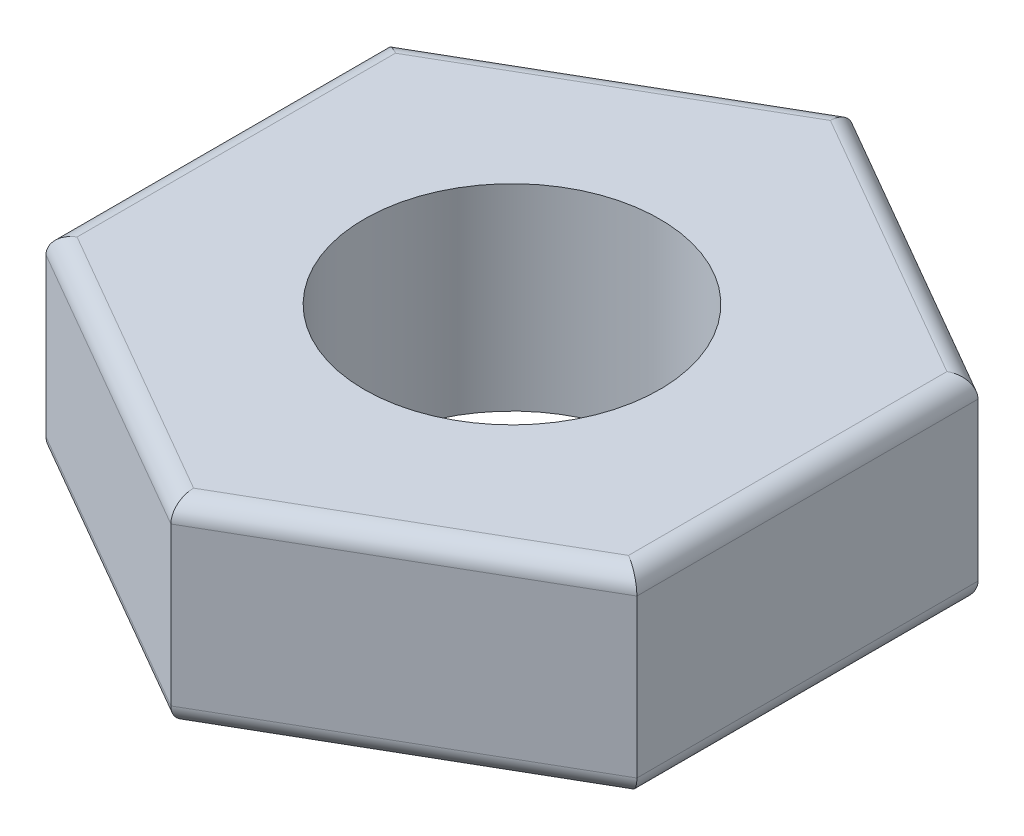
ISO-10303-21;
HEADER;
FILE_DESCRIPTION(('STEP AP214'),'2;1');
FILE_NAME('part.step','',(''),(''),'','','');
FILE_SCHEMA(('AUTOMOTIVE_DESIGN { 1 0 10303 214 1 1 1 1 }'));
ENDSEC;
DATA;
#1=APPLICATION_CONTEXT('core data for automotive mechanical design processes');
#2=APPLICATION_PROTOCOL_DEFINITION('international standard','automotive_design',2000,#1);
#3=PRODUCT_CONTEXT('',#1,'mechanical');
#4=PRODUCT('Part','Part','',(#3));
#5=PRODUCT_RELATED_PRODUCT_CATEGORY('part','',(#4));
#6=PRODUCT_DEFINITION_FORMATION('','',#4);
#7=PRODUCT_DEFINITION_CONTEXT('part definition',#1,'design');
#8=PRODUCT_DEFINITION('design','',#6,#7);
#9=PRODUCT_DEFINITION_SHAPE('','',#8);
#10=(LENGTH_UNIT() NAMED_UNIT(*) SI_UNIT(.MILLI.,.METRE.));
#11=(NAMED_UNIT(*) PLANE_ANGLE_UNIT() SI_UNIT($,.RADIAN.));
#12=(NAMED_UNIT(*) SI_UNIT($,.STERADIAN.) SOLID_ANGLE_UNIT());
#13=UNCERTAINTY_MEASURE_WITH_UNIT(LENGTH_MEASURE(1.E-05),#10,'distance_accuracy_value','');
#14=(GEOMETRIC_REPRESENTATION_CONTEXT(3) GLOBAL_UNCERTAINTY_ASSIGNED_CONTEXT((#13)) GLOBAL_UNIT_ASSIGNED_CONTEXT((#10,
#11,#12)) REPRESENTATION_CONTEXT('',''));
#15=CARTESIAN_POINT('',(0.,0.,0.));
#16=DIRECTION('',(0.,0.,1.));
#17=DIRECTION('',(1.,0.,0.));
#18=AXIS2_PLACEMENT_3D('',#15,#16,#17);
#19=CARTESIAN_POINT('',(0.,4.,0.));
#20=DIRECTION('',(0.,1.,0.));
#21=DIRECTION('',(0.,0.,1.));
#22=AXIS2_PLACEMENT_3D('',#19,#20,#21);
#23=PLANE('',#22);
#24=DIRECTION('',(-0.866025403784439,0.,0.5));
#25=VECTOR('',#24,1.);
#26=CARTESIAN_POINT('',(-5.8,4.,-3.11769145362398));
#27=LINE('',#26,#25);
#28=CARTESIAN_POINT('',(0.,4.,-6.46632301492381));
#29=VERTEX_POINT('',#28);
#30=CARTESIAN_POINT('',(-5.6,4.,-3.2331615074619));
#31=VERTEX_POINT('',#30);
#32=EDGE_CURVE('E50',#29,#31,#27,.T.);
#33=ORIENTED_EDGE('',*,*,#32,.T.);
#34=DIRECTION('',(0.,0.,1.));
#35=VECTOR('',#34,1.);
#36=CARTESIAN_POINT('',(-5.6,4.,3.46410161513776));
#37=LINE('',#36,#35);
#38=CARTESIAN_POINT('',(-5.6,4.,3.23316150746191));
#39=VERTEX_POINT('',#38);
#40=EDGE_CURVE('E11',#31,#39,#37,.T.);
#41=ORIENTED_EDGE('',*,*,#40,.T.);
#42=DIRECTION('',(0.866025403784439,0.,0.5));
#43=VECTOR('',#42,1.);
#44=CARTESIAN_POINT('',(0.199999999999999,4.,6.58179306876174));
#45=LINE('',#44,#43);
#46=CARTESIAN_POINT('',(0.,4.,6.46632301492381));
#47=VERTEX_POINT('',#46);
#48=EDGE_CURVE('E194',#39,#47,#45,.T.);
#49=ORIENTED_EDGE('',*,*,#48,.T.);
#50=DIRECTION('',(0.866025403784439,0.,-0.5));
#51=VECTOR('',#50,1.);
#52=CARTESIAN_POINT('',(5.8,4.,3.11769145362398));
#53=LINE('',#52,#51);
#54=CARTESIAN_POINT('',(5.6,4.,3.2331615074619));
#55=VERTEX_POINT('',#54);
#56=EDGE_CURVE('E192',#47,#55,#53,.T.);
#57=ORIENTED_EDGE('',*,*,#56,.T.);
#58=DIRECTION('',(0.,0.,-1.));
#59=VECTOR('',#58,1.);
#60=CARTESIAN_POINT('',(5.6,4.,-3.46410161513776));
#61=LINE('',#60,#59);
#62=CARTESIAN_POINT('',(5.6,4.,-3.23316150746191));
#63=VERTEX_POINT('',#62);
#64=EDGE_CURVE('E190',#55,#63,#61,.T.);
#65=ORIENTED_EDGE('',*,*,#64,.T.);
#66=DIRECTION('',(-0.866025403784439,0.,-0.5));
#67=VECTOR('',#66,1.);
#68=CARTESIAN_POINT('',(-0.200000000000001,4.,-6.58179306876173));
#69=LINE('',#68,#67);
#70=EDGE_CURVE('E61',#63,#29,#69,.T.);
#71=ORIENTED_EDGE('',*,*,#70,.T.);
#72=EDGE_LOOP('',(#33,#41,#49,#57,#65,#71));
#73=FACE_BOUND('',#72,.T.);
#74=CARTESIAN_POINT('',(0.,4.,0.));
#75=DIRECTION('',(0.,1.,0.));
#76=DIRECTION('',(0.,0.,1.));
#77=AXIS2_PLACEMENT_3D('',#74,#75,#76);
#78=CIRCLE('',#77,3.);
#79=CARTESIAN_POINT('',(0.,4.,3.));
#80=VERTEX_POINT('',#79);
#81=EDGE_CURVE('E238',#80,#80,#78,.T.);
#82=ORIENTED_EDGE('',*,*,#81,.F.);
#83=EDGE_LOOP('',(#82));
#84=FACE_BOUND('',#83,.T.);
#85=ADVANCED_FACE('F41',(#73,#84),#23,.T.);
#86=CARTESIAN_POINT('',(0.,0.,0.));
#87=DIRECTION('',(0.,1.,0.));
#88=DIRECTION('',(0.,0.,1.));
#89=AXIS2_PLACEMENT_3D('',#86,#87,#88);
#90=PLANE('',#89);
#91=DIRECTION('',(-0.866025403784439,0.,0.5));
#92=VECTOR('',#91,1.);
#93=CARTESIAN_POINT('',(-2.8,0.,-4.84974226119286));
#94=LINE('',#93,#92);
#95=CARTESIAN_POINT('',(-5.6,0.,-3.2331615074619));
#96=VERTEX_POINT('',#95);
#97=CARTESIAN_POINT('',(0.,0.,-6.46632301492381));
#98=VERTEX_POINT('',#97);
#99=EDGE_CURVE('E219',#96,#98,#94,.F.);
#100=ORIENTED_EDGE('',*,*,#99,.T.);
#101=DIRECTION('',(-0.866025403784439,0.,-0.5));
#102=VECTOR('',#101,1.);
#103=CARTESIAN_POINT('',(2.8,0.,-4.84974226119286));
#104=LINE('',#103,#102);
#105=CARTESIAN_POINT('',(5.6,0.,-3.23316150746191));
#106=VERTEX_POINT('',#105);
#107=EDGE_CURVE('E212',#98,#106,#104,.F.);
#108=ORIENTED_EDGE('',*,*,#107,.T.);
#109=DIRECTION('',(0.,0.,-1.));
#110=VECTOR('',#109,1.);
#111=CARTESIAN_POINT('',(5.6,0.,0.));
#112=LINE('',#111,#110);
#113=CARTESIAN_POINT('',(5.6,0.,3.2331615074619));
#114=VERTEX_POINT('',#113);
#115=EDGE_CURVE('E215',#106,#114,#112,.F.);
#116=ORIENTED_EDGE('',*,*,#115,.T.);
#117=DIRECTION('',(0.866025403784439,0.,-0.5));
#118=VECTOR('',#117,1.);
#119=CARTESIAN_POINT('',(2.8,0.,4.84974226119286));
#120=LINE('',#119,#118);
#121=CARTESIAN_POINT('',(0.,0.,6.46632301492381));
#122=VERTEX_POINT('',#121);
#123=EDGE_CURVE('E217',#114,#122,#120,.F.);
#124=ORIENTED_EDGE('',*,*,#123,.T.);
#125=DIRECTION('',(0.866025403784439,0.,0.5));
#126=VECTOR('',#125,1.);
#127=CARTESIAN_POINT('',(-2.8,0.,4.84974226119286));
#128=LINE('',#127,#126);
#129=CARTESIAN_POINT('',(-5.6,0.,3.23316150746191));
#130=VERTEX_POINT('',#129);
#131=EDGE_CURVE('E223',#122,#130,#128,.F.);
#132=ORIENTED_EDGE('',*,*,#131,.T.);
#133=DIRECTION('',(0.,0.,1.));
#134=VECTOR('',#133,1.);
#135=CARTESIAN_POINT('',(-5.6,0.,0.));
#136=LINE('',#135,#134);
#137=EDGE_CURVE('E221',#130,#96,#136,.F.);
#138=ORIENTED_EDGE('',*,*,#137,.T.);
#139=EDGE_LOOP('',(#100,#108,#116,#124,#132,#138));
#140=FACE_BOUND('',#139,.T.);
#141=CARTESIAN_POINT('',(0.,0.,0.));
#142=DIRECTION('',(0.,1.,0.));
#143=DIRECTION('',(0.,0.,1.));
#144=AXIS2_PLACEMENT_3D('',#141,#142,#143);
#145=CIRCLE('',#144,3.);
#146=CARTESIAN_POINT('',(0.,0.,3.));
#147=VERTEX_POINT('',#146);
#148=EDGE_CURVE('E174',#147,#147,#145,.T.);
#149=ORIENTED_EDGE('',*,*,#148,.T.);
#150=EDGE_LOOP('',(#149));
#151=FACE_BOUND('',#150,.T.);
#152=ADVANCED_FACE('F248',(#140,#151),#90,.F.);
#153=CARTESIAN_POINT('',(6.,4.,-3.46410161513776));
#154=DIRECTION('',(-0.5,0.,0.866025403784439));
#155=DIRECTION('',(0.866025403784439,0.,0.5));
#156=AXIS2_PLACEMENT_3D('',#153,#154,#155);
#157=PLANE('',#156);
#158=DIRECTION('',(0.,-1.,0.));
#159=VECTOR('',#158,1.);
#160=CARTESIAN_POINT('',(6.,4.,-3.46410161513776));
#161=LINE('',#160,#159);
#162=CARTESIAN_POINT('',(6.,3.6,-3.46410161513776));
#163=VERTEX_POINT('',#162);
#164=CARTESIAN_POINT('',(6.,0.4,-3.46410161513776));
#165=VERTEX_POINT('',#164);
#166=EDGE_CURVE('E236',#163,#165,#161,.T.);
#167=ORIENTED_EDGE('',*,*,#166,.T.);
#168=DIRECTION('',(-0.866025403784439,0.,-0.5));
#169=VECTOR('',#168,1.);
#170=CARTESIAN_POINT('',(6.,0.4,-3.46410161513776));
#171=LINE('',#170,#169);
#172=CARTESIAN_POINT('',(0.,0.4,-6.92820323027551));
#173=VERTEX_POINT('',#172);
#174=EDGE_CURVE('E151',#165,#173,#171,.T.);
#175=ORIENTED_EDGE('',*,*,#174,.T.);
#176=DIRECTION('',(0.,-1.,0.));
#177=VECTOR('',#176,1.);
#178=CARTESIAN_POINT('',(0.,4.,-6.92820323027551));
#179=LINE('',#178,#177);
#180=CARTESIAN_POINT('',(0.,3.6,-6.92820323027551));
#181=VERTEX_POINT('',#180);
#182=EDGE_CURVE('E134',#181,#173,#179,.T.);
#183=ORIENTED_EDGE('',*,*,#182,.F.);
#184=DIRECTION('',(-0.866025403784439,0.,-0.5));
#185=VECTOR('',#184,1.);
#186=CARTESIAN_POINT('',(6.,3.6,-3.46410161513776));
#187=LINE('',#186,#185);
#188=EDGE_CURVE('E148',#181,#163,#187,.F.);
#189=ORIENTED_EDGE('',*,*,#188,.T.);
#190=EDGE_LOOP('',(#167,#175,#183,#189));
#191=FACE_BOUND('',#190,.T.);
#192=ADVANCED_FACE('F147',(#191),#157,.F.);
#193=CARTESIAN_POINT('',(0.,4.,-6.92820323027551));
#194=DIRECTION('',(0.5,0.,0.866025403784439));
#195=DIRECTION('',(0.866025403784439,0.,-0.5));
#196=AXIS2_PLACEMENT_3D('',#193,#194,#195);
#197=PLANE('',#196);
#198=ORIENTED_EDGE('',*,*,#182,.T.);
#199=DIRECTION('',(-0.866025403784439,0.,0.5));
#200=VECTOR('',#199,1.);
#201=CARTESIAN_POINT('',(0.,0.4,-6.92820323027551));
#202=LINE('',#201,#200);
#203=CARTESIAN_POINT('',(-6.,0.4,-3.46410161513775));
#204=VERTEX_POINT('',#203);
#205=EDGE_CURVE('E140',#173,#204,#202,.T.);
#206=ORIENTED_EDGE('',*,*,#205,.T.);
#207=DIRECTION('',(0.,-1.,0.));
#208=VECTOR('',#207,1.);
#209=CARTESIAN_POINT('',(-6.,4.,-3.46410161513775));
#210=LINE('',#209,#208);
#211=CARTESIAN_POINT('',(-6.,3.6,-3.46410161513775));
#212=VERTEX_POINT('',#211);
#213=EDGE_CURVE('E136',#212,#204,#210,.T.);
#214=ORIENTED_EDGE('',*,*,#213,.F.);
#215=DIRECTION('',(-0.866025403784439,0.,0.5));
#216=VECTOR('',#215,1.);
#217=CARTESIAN_POINT('',(0.,3.6,-6.92820323027551));
#218=LINE('',#217,#216);
#219=EDGE_CURVE('E131',#212,#181,#218,.F.);
#220=ORIENTED_EDGE('',*,*,#219,.T.);
#221=EDGE_LOOP('',(#198,#206,#214,#220));
#222=FACE_BOUND('',#221,.T.);
#223=ADVANCED_FACE('F133',(#222),#197,.F.);
#224=CARTESIAN_POINT('',(-6.,4.,-3.46410161513775));
#225=DIRECTION('',(1.,0.,0.));
#226=DIRECTION('',(0.,0.,-1.));
#227=AXIS2_PLACEMENT_3D('',#224,#225,#226);
#228=PLANE('',#227);
#229=ORIENTED_EDGE('',*,*,#213,.T.);
#230=DIRECTION('',(0.,0.,1.));
#231=VECTOR('',#230,1.);
#232=CARTESIAN_POINT('',(-6.,0.4,-3.46410161513775));
#233=LINE('',#232,#231);
#234=CARTESIAN_POINT('',(-6.,0.4,3.46410161513776));
#235=VERTEX_POINT('',#234);
#236=EDGE_CURVE('E200',#204,#235,#233,.T.);
#237=ORIENTED_EDGE('',*,*,#236,.T.);
#238=DIRECTION('',(0.,-1.,0.));
#239=VECTOR('',#238,1.);
#240=CARTESIAN_POINT('',(-6.,4.,3.46410161513776));
#241=LINE('',#240,#239);
#242=CARTESIAN_POINT('',(-6.,3.6,3.46410161513776));
#243=VERTEX_POINT('',#242);
#244=EDGE_CURVE('E227',#243,#235,#241,.T.);
#245=ORIENTED_EDGE('',*,*,#244,.F.);
#246=DIRECTION('',(0.,0.,1.));
#247=VECTOR('',#246,1.);
#248=CARTESIAN_POINT('',(-6.,3.6,-3.46410161513775));
#249=LINE('',#248,#247);
#250=EDGE_CURVE('E202',#243,#212,#249,.F.);
#251=ORIENTED_EDGE('',*,*,#250,.T.);
#252=EDGE_LOOP('',(#229,#237,#245,#251));
#253=FACE_BOUND('',#252,.T.);
#254=ADVANCED_FACE('F268',(#253),#228,.F.);
#255=CARTESIAN_POINT('',(-6.,4.,3.46410161513776));
#256=DIRECTION('',(0.5,0.,-0.866025403784439));
#257=DIRECTION('',(-0.866025403784439,0.,-0.5));
#258=AXIS2_PLACEMENT_3D('',#255,#256,#257);
#259=PLANE('',#258);
#260=ORIENTED_EDGE('',*,*,#244,.T.);
#261=DIRECTION('',(0.866025403784439,0.,0.5));
#262=VECTOR('',#261,1.);
#263=CARTESIAN_POINT('',(-6.,0.4,3.46410161513776));
#264=LINE('',#263,#262);
#265=CARTESIAN_POINT('',(0.,0.4,6.92820323027551));
#266=VERTEX_POINT('',#265);
#267=EDGE_CURVE('E196',#235,#266,#264,.T.);
#268=ORIENTED_EDGE('',*,*,#267,.T.);
#269=DIRECTION('',(0.,-1.,0.));
#270=VECTOR('',#269,1.);
#271=CARTESIAN_POINT('',(0.,4.,6.92820323027551));
#272=LINE('',#271,#270);
#273=CARTESIAN_POINT('',(0.,3.6,6.92820323027551));
#274=VERTEX_POINT('',#273);
#275=EDGE_CURVE('E230',#274,#266,#272,.T.);
#276=ORIENTED_EDGE('',*,*,#275,.F.);
#277=DIRECTION('',(0.866025403784439,0.,0.5));
#278=VECTOR('',#277,1.);
#279=CARTESIAN_POINT('',(-6.,3.6,3.46410161513776));
#280=LINE('',#279,#278);
#281=EDGE_CURVE('E198',#274,#243,#280,.F.);
#282=ORIENTED_EDGE('',*,*,#281,.T.);
#283=EDGE_LOOP('',(#260,#268,#276,#282));
#284=FACE_BOUND('',#283,.T.);
#285=ADVANCED_FACE('F264',(#284),#259,.F.);
#286=CARTESIAN_POINT('',(0.,4.,6.92820323027551));
#287=DIRECTION('',(-0.5,0.,-0.866025403784439));
#288=DIRECTION('',(-0.866025403784439,0.,0.5));
#289=AXIS2_PLACEMENT_3D('',#286,#287,#288);
#290=PLANE('',#289);
#291=ORIENTED_EDGE('',*,*,#275,.T.);
#292=DIRECTION('',(0.866025403784439,0.,-0.5));
#293=VECTOR('',#292,1.);
#294=CARTESIAN_POINT('',(0.,0.4,6.92820323027551));
#295=LINE('',#294,#293);
#296=CARTESIAN_POINT('',(6.,0.4,3.46410161513775));
#297=VERTEX_POINT('',#296);
#298=EDGE_CURVE('E141',#266,#297,#295,.T.);
#299=ORIENTED_EDGE('',*,*,#298,.T.);
#300=DIRECTION('',(0.,-1.,0.));
#301=VECTOR('',#300,1.);
#302=CARTESIAN_POINT('',(6.,4.,3.46410161513775));
#303=LINE('',#302,#301);
#304=CARTESIAN_POINT('',(6.,3.6,3.46410161513775));
#305=VERTEX_POINT('',#304);
#306=EDGE_CURVE('E233',#305,#297,#303,.T.);
#307=ORIENTED_EDGE('',*,*,#306,.F.);
#308=DIRECTION('',(0.866025403784439,0.,-0.5));
#309=VECTOR('',#308,1.);
#310=CARTESIAN_POINT('',(0.,3.6,6.92820323027551));
#311=LINE('',#310,#309);
#312=EDGE_CURVE('E206',#305,#274,#311,.F.);
#313=ORIENTED_EDGE('',*,*,#312,.T.);
#314=EDGE_LOOP('',(#291,#299,#307,#313));
#315=FACE_BOUND('',#314,.T.);
#316=ADVANCED_FACE('F260',(#315),#290,.F.);
#317=CARTESIAN_POINT('',(6.,4.,3.46410161513775));
#318=DIRECTION('',(-1.,0.,0.));
#319=DIRECTION('',(0.,0.,1.));
#320=AXIS2_PLACEMENT_3D('',#317,#318,#319);
#321=PLANE('',#320);
#322=ORIENTED_EDGE('',*,*,#306,.T.);
#323=DIRECTION('',(0.,0.,-1.));
#324=VECTOR('',#323,1.);
#325=CARTESIAN_POINT('',(6.,0.4,3.46410161513775));
#326=LINE('',#325,#324);
#327=EDGE_CURVE('E208',#297,#165,#326,.T.);
#328=ORIENTED_EDGE('',*,*,#327,.T.);
#329=ORIENTED_EDGE('',*,*,#166,.F.);
#330=DIRECTION('',(0.,0.,-1.));
#331=VECTOR('',#330,1.);
#332=CARTESIAN_POINT('',(6.,3.6,3.46410161513775));
#333=LINE('',#332,#331);
#334=EDGE_CURVE('E210',#163,#305,#333,.F.);
#335=ORIENTED_EDGE('',*,*,#334,.T.);
#336=EDGE_LOOP('',(#322,#328,#329,#335));
#337=FACE_BOUND('',#336,.T.);
#338=ADVANCED_FACE('F257',(#337),#321,.F.);
#339=CARTESIAN_POINT('',(0.,4.,0.));
#340=DIRECTION('',(0.,-1.,0.));
#341=DIRECTION('',(0.,0.,-1.));
#342=AXIS2_PLACEMENT_3D('',#339,#340,#341);
#343=CYLINDRICAL_SURFACE('',#342,3.);
#344=ORIENTED_EDGE('',*,*,#81,.T.);
#345=EDGE_LOOP('',(#344));
#346=FACE_BOUND('',#345,.T.);
#347=ORIENTED_EDGE('',*,*,#148,.F.);
#348=EDGE_LOOP('',(#347));
#349=FACE_BOUND('',#348,.T.);
#350=ADVANCED_FACE('F244',(#346,#349),#343,.F.);
#351=CARTESIAN_POINT('',(-5.8,0.4,3.11769145362398));
#352=DIRECTION('',(0.866025403784439,0.,0.5));
#353=DIRECTION('',(0.5,0.,-0.866025403784439));
#354=AXIS2_PLACEMENT_3D('',#351,#352,#353);
#355=CYLINDRICAL_SURFACE('',#354,0.4);
#356=CARTESIAN_POINT('',(-5.6,0.4,3.23316150746191));
#357=DIRECTION('',(0.5,0.,0.866025403784439));
#358=DIRECTION('',(0.866025403784439,0.,-0.5));
#359=AXIS2_PLACEMENT_3D('',#356,#357,#358);
#360=ELLIPSE('',#359,0.461880215351701,0.4);
#361=EDGE_CURVE('E175',#130,#235,#360,.F.);
#362=ORIENTED_EDGE('',*,*,#361,.F.);
#363=ORIENTED_EDGE('',*,*,#131,.F.);
#364=CARTESIAN_POINT('',(0.,0.4,6.46632301492381));
#365=DIRECTION('',(1.,0.,0.));
#366=DIRECTION('',(0.,0.,1.));
#367=AXIS2_PLACEMENT_3D('',#364,#365,#366);
#368=ELLIPSE('',#367,0.461880215351701,0.4);
#369=EDGE_CURVE('E171',#266,#122,#368,.T.);
#370=ORIENTED_EDGE('',*,*,#369,.F.);
#371=ORIENTED_EDGE('',*,*,#267,.F.);
#372=EDGE_LOOP('',(#362,#363,#370,#371));
#373=FACE_BOUND('',#372,.T.);
#374=ADVANCED_FACE('F296',(#373),#355,.T.);
#375=CARTESIAN_POINT('',(-0.2,0.4,6.58179306876174));
#376=DIRECTION('',(0.866025403784439,0.,-0.5));
#377=DIRECTION('',(-0.5,0.,-0.866025403784439));
#378=AXIS2_PLACEMENT_3D('',#375,#376,#377);
#379=CYLINDRICAL_SURFACE('',#378,0.4);
#380=ORIENTED_EDGE('',*,*,#369,.T.);
#381=ORIENTED_EDGE('',*,*,#123,.F.);
#382=CARTESIAN_POINT('',(5.6,0.4,3.2331615074619));
#383=DIRECTION('',(0.5,0.,-0.866025403784439));
#384=DIRECTION('',(0.866025403784439,0.,0.5));
#385=AXIS2_PLACEMENT_3D('',#382,#383,#384);
#386=ELLIPSE('',#385,0.461880215351701,0.4);
#387=EDGE_CURVE('E178',#297,#114,#386,.T.);
#388=ORIENTED_EDGE('',*,*,#387,.F.);
#389=ORIENTED_EDGE('',*,*,#298,.F.);
#390=EDGE_LOOP('',(#380,#381,#388,#389));
#391=FACE_BOUND('',#390,.T.);
#392=ADVANCED_FACE('F292',(#391),#379,.T.);
#393=CARTESIAN_POINT('',(-5.6,0.4,-3.46410161513775));
#394=DIRECTION('',(0.,0.,1.));
#395=DIRECTION('',(1.,0.,0.));
#396=AXIS2_PLACEMENT_3D('',#393,#394,#395);
#397=CYLINDRICAL_SURFACE('',#396,0.4);
#398=ORIENTED_EDGE('',*,*,#361,.T.);
#399=ORIENTED_EDGE('',*,*,#236,.F.);
#400=CARTESIAN_POINT('',(-5.6,0.4,-3.2331615074619));
#401=DIRECTION('',(-0.5,0.,0.866025403784439));
#402=DIRECTION('',(0.866025403784439,0.,0.5));
#403=AXIS2_PLACEMENT_3D('',#400,#401,#402);
#404=ELLIPSE('',#403,0.461880215351701,0.4);
#405=EDGE_CURVE('E181',#96,#204,#404,.F.);
#406=ORIENTED_EDGE('',*,*,#405,.F.);
#407=ORIENTED_EDGE('',*,*,#137,.F.);
#408=EDGE_LOOP('',(#398,#399,#406,#407));
#409=FACE_BOUND('',#408,.T.);
#410=ADVANCED_FACE('F288',(#409),#397,.T.);
#411=CARTESIAN_POINT('',(5.6,0.4,3.46410161513775));
#412=DIRECTION('',(0.,0.,-1.));
#413=DIRECTION('',(-1.,0.,0.));
#414=AXIS2_PLACEMENT_3D('',#411,#412,#413);
#415=CYLINDRICAL_SURFACE('',#414,0.4);
#416=ORIENTED_EDGE('',*,*,#387,.T.);
#417=ORIENTED_EDGE('',*,*,#115,.F.);
#418=CARTESIAN_POINT('',(5.6,0.4,-3.23316150746191));
#419=DIRECTION('',(-0.5,0.,-0.866025403784438));
#420=DIRECTION('',(0.866025403784438,0.,-0.5));
#421=AXIS2_PLACEMENT_3D('',#418,#419,#420);
#422=ELLIPSE('',#421,0.461880215351701,0.4);
#423=EDGE_CURVE('E184',#165,#106,#422,.T.);
#424=ORIENTED_EDGE('',*,*,#423,.F.);
#425=ORIENTED_EDGE('',*,*,#327,.F.);
#426=EDGE_LOOP('',(#416,#417,#424,#425));
#427=FACE_BOUND('',#426,.T.);
#428=ADVANCED_FACE('F284',(#427),#415,.T.);
#429=CARTESIAN_POINT('',(0.2,0.4,-6.58179306876173));
#430=DIRECTION('',(-0.866025403784439,0.,0.5));
#431=DIRECTION('',(0.5,0.,0.866025403784439));
#432=AXIS2_PLACEMENT_3D('',#429,#430,#431);
#433=CYLINDRICAL_SURFACE('',#432,0.4);
#434=ORIENTED_EDGE('',*,*,#405,.T.);
#435=ORIENTED_EDGE('',*,*,#205,.F.);
#436=CARTESIAN_POINT('',(0.,0.4,-6.46632301492381));
#437=DIRECTION('',(-1.,0.,0.));
#438=DIRECTION('',(0.,0.,1.));
#439=AXIS2_PLACEMENT_3D('',#436,#437,#438);
#440=ELLIPSE('',#439,0.461880215351701,0.4);
#441=EDGE_CURVE('E186',#98,#173,#440,.F.);
#442=ORIENTED_EDGE('',*,*,#441,.F.);
#443=ORIENTED_EDGE('',*,*,#99,.F.);
#444=EDGE_LOOP('',(#434,#435,#442,#443));
#445=FACE_BOUND('',#444,.T.);
#446=ADVANCED_FACE('F280',(#445),#433,.T.);
#447=CARTESIAN_POINT('',(5.8,0.4,-3.11769145362398));
#448=DIRECTION('',(-0.866025403784439,0.,-0.5));
#449=DIRECTION('',(-0.5,0.,0.866025403784439));
#450=AXIS2_PLACEMENT_3D('',#447,#448,#449);
#451=CYLINDRICAL_SURFACE('',#450,0.4);
#452=ORIENTED_EDGE('',*,*,#423,.T.);
#453=ORIENTED_EDGE('',*,*,#107,.F.);
#454=ORIENTED_EDGE('',*,*,#441,.T.);
#455=ORIENTED_EDGE('',*,*,#174,.F.);
#456=EDGE_LOOP('',(#452,#453,#454,#455));
#457=FACE_BOUND('',#456,.T.);
#458=ADVANCED_FACE('F277',(#457),#451,.T.);
#459=CARTESIAN_POINT('',(5.6,3.6,0.));
#460=DIRECTION('',(0.,0.,1.));
#461=DIRECTION('',(1.,0.,0.));
#462=AXIS2_PLACEMENT_3D('',#459,#460,#461);
#463=CYLINDRICAL_SURFACE('',#462,0.4);
#464=CARTESIAN_POINT('',(5.6,3.6,3.2331615074619));
#465=DIRECTION('',(-0.5,0.,0.866025403784439));
#466=DIRECTION('',(-0.866025403784439,0.,-0.5));
#467=AXIS2_PLACEMENT_3D('',#464,#465,#466);
#468=ELLIPSE('',#467,0.461880215351701,0.4);
#469=EDGE_CURVE('E160',#305,#55,#468,.T.);
#470=ORIENTED_EDGE('',*,*,#469,.F.);
#471=ORIENTED_EDGE('',*,*,#334,.F.);
#472=CARTESIAN_POINT('',(5.6,3.6,-3.23316150746191));
#473=DIRECTION('',(0.5,0.,0.866025403784438));
#474=DIRECTION('',(-0.866025403784438,0.,0.5));
#475=AXIS2_PLACEMENT_3D('',#472,#473,#474);
#476=ELLIPSE('',#475,0.461880215351701,0.4);
#477=EDGE_CURVE('E45',#63,#163,#476,.F.);
#478=ORIENTED_EDGE('',*,*,#477,.F.);
#479=ORIENTED_EDGE('',*,*,#64,.F.);
#480=EDGE_LOOP('',(#470,#471,#478,#479));
#481=FACE_BOUND('',#480,.T.);
#482=ADVANCED_FACE('F43',(#481),#463,.T.);
#483=CARTESIAN_POINT('',(2.8,3.6,-4.84974226119286));
#484=DIRECTION('',(0.866025403784439,0.,0.5));
#485=DIRECTION('',(0.5,0.,-0.866025403784439));
#486=AXIS2_PLACEMENT_3D('',#483,#484,#485);
#487=CYLINDRICAL_SURFACE('',#486,0.4);
#488=ORIENTED_EDGE('',*,*,#477,.T.);
#489=ORIENTED_EDGE('',*,*,#188,.F.);
#490=CARTESIAN_POINT('',(0.,3.6,-6.46632301492381));
#491=DIRECTION('',(1.,0.,0.));
#492=DIRECTION('',(0.,0.,1.));
#493=AXIS2_PLACEMENT_3D('',#490,#491,#492);
#494=ELLIPSE('',#493,0.461880215351701,0.4);
#495=EDGE_CURVE('E156',#29,#181,#494,.F.);
#496=ORIENTED_EDGE('',*,*,#495,.F.);
#497=ORIENTED_EDGE('',*,*,#70,.F.);
#498=EDGE_LOOP('',(#488,#489,#496,#497));
#499=FACE_BOUND('',#498,.T.);
#500=ADVANCED_FACE('F155',(#499),#487,.T.);
#501=CARTESIAN_POINT('',(2.8,3.6,4.84974226119286));
#502=DIRECTION('',(-0.866025403784439,0.,0.5));
#503=DIRECTION('',(0.5,0.,0.866025403784439));
#504=AXIS2_PLACEMENT_3D('',#501,#502,#503);
#505=CYLINDRICAL_SURFACE('',#504,0.4);
#506=ORIENTED_EDGE('',*,*,#469,.T.);
#507=ORIENTED_EDGE('',*,*,#56,.F.);
#508=CARTESIAN_POINT('',(0.,3.6,6.46632301492381));
#509=DIRECTION('',(-1.,0.,0.));
#510=DIRECTION('',(0.,0.,-1.));
#511=AXIS2_PLACEMENT_3D('',#508,#509,#510);
#512=ELLIPSE('',#511,0.461880215351701,0.4);
#513=EDGE_CURVE('E161',#274,#47,#512,.T.);
#514=ORIENTED_EDGE('',*,*,#513,.F.);
#515=ORIENTED_EDGE('',*,*,#312,.F.);
#516=EDGE_LOOP('',(#506,#507,#514,#515));
#517=FACE_BOUND('',#516,.T.);
#518=ADVANCED_FACE('F311',(#517),#505,.T.);
#519=CARTESIAN_POINT('',(-2.8,3.6,-4.84974226119286));
#520=DIRECTION('',(0.866025403784439,0.,-0.5));
#521=DIRECTION('',(-0.5,0.,-0.866025403784439));
#522=AXIS2_PLACEMENT_3D('',#519,#520,#521);
#523=CYLINDRICAL_SURFACE('',#522,0.4);
#524=ORIENTED_EDGE('',*,*,#495,.T.);
#525=ORIENTED_EDGE('',*,*,#219,.F.);
#526=CARTESIAN_POINT('',(-5.6,3.6,-3.2331615074619));
#527=DIRECTION('',(0.5,0.,-0.866025403784439));
#528=DIRECTION('',(0.866025403784439,0.,0.5));
#529=AXIS2_PLACEMENT_3D('',#526,#527,#528);
#530=ELLIPSE('',#529,0.461880215351701,0.4);
#531=EDGE_CURVE('E165',#31,#212,#530,.F.);
#532=ORIENTED_EDGE('',*,*,#531,.F.);
#533=ORIENTED_EDGE('',*,*,#32,.F.);
#534=EDGE_LOOP('',(#524,#525,#532,#533));
#535=FACE_BOUND('',#534,.T.);
#536=ADVANCED_FACE('F159',(#535),#523,.T.);
#537=CARTESIAN_POINT('',(-2.8,3.6,4.84974226119286));
#538=DIRECTION('',(-0.866025403784439,0.,-0.5));
#539=DIRECTION('',(-0.5,0.,0.866025403784439));
#540=AXIS2_PLACEMENT_3D('',#537,#538,#539);
#541=CYLINDRICAL_SURFACE('',#540,0.4);
#542=ORIENTED_EDGE('',*,*,#513,.T.);
#543=ORIENTED_EDGE('',*,*,#48,.F.);
#544=CARTESIAN_POINT('',(-5.6,3.6,3.23316150746191));
#545=DIRECTION('',(-0.5,0.,-0.866025403784439));
#546=DIRECTION('',(-0.866025403784439,0.,0.5));
#547=AXIS2_PLACEMENT_3D('',#544,#545,#546);
#548=ELLIPSE('',#547,0.461880215351701,0.4);
#549=EDGE_CURVE('E169',#243,#39,#548,.T.);
#550=ORIENTED_EDGE('',*,*,#549,.F.);
#551=ORIENTED_EDGE('',*,*,#281,.F.);
#552=EDGE_LOOP('',(#542,#543,#550,#551));
#553=FACE_BOUND('',#552,.T.);
#554=ADVANCED_FACE('F304',(#553),#541,.T.);
#555=CARTESIAN_POINT('',(-5.6,3.6,0.));
#556=DIRECTION('',(0.,0.,-1.));
#557=DIRECTION('',(-1.,0.,0.));
#558=AXIS2_PLACEMENT_3D('',#555,#556,#557);
#559=CYLINDRICAL_SURFACE('',#558,0.4);
#560=ORIENTED_EDGE('',*,*,#531,.T.);
#561=ORIENTED_EDGE('',*,*,#250,.F.);
#562=ORIENTED_EDGE('',*,*,#549,.T.);
#563=ORIENTED_EDGE('',*,*,#40,.F.);
#564=EDGE_LOOP('',(#560,#561,#562,#563));
#565=FACE_BOUND('',#564,.T.);
#566=ADVANCED_FACE('F301',(#565),#559,.T.);
#567=CLOSED_SHELL('',(#85,#152,#192,#223,#254,#285,#316,#338,#350,#374,#392,#410,#428,#446,#458,
#482,#500,#518,#536,#554,#566));
#568=MANIFOLD_SOLID_BREP('B2',#567);
#569=ADVANCED_BREP_SHAPE_REPRESENTATION('',(#18,#568),#14);
#570=SHAPE_DEFINITION_REPRESENTATION(#9,#569);
ENDSEC;
END-ISO-10303-21;
